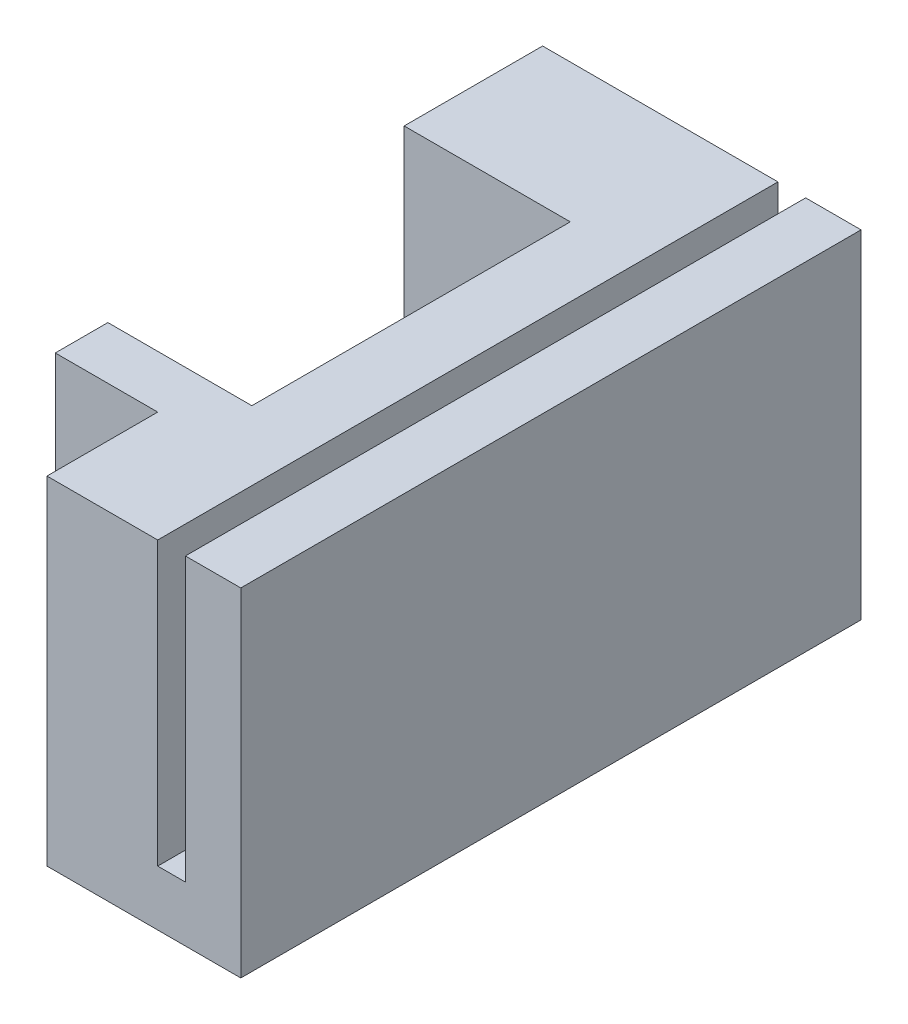
ISO-10303-21;
HEADER;
FILE_DESCRIPTION(('STEP AP214'),'2;1');
FILE_NAME('part.step','',(''),(''),'','','');
FILE_SCHEMA(('AUTOMOTIVE_DESIGN { 1 0 10303 214 1 1 1 1 }'));
ENDSEC;
DATA;
#1=APPLICATION_CONTEXT('core data for automotive mechanical design processes');
#2=APPLICATION_PROTOCOL_DEFINITION('international standard','automotive_design',2000,#1);
#3=PRODUCT_CONTEXT('',#1,'mechanical');
#4=PRODUCT('Part','Part','',(#3));
#5=PRODUCT_RELATED_PRODUCT_CATEGORY('part','',(#4));
#6=PRODUCT_DEFINITION_FORMATION('','',#4);
#7=PRODUCT_DEFINITION_CONTEXT('part definition',#1,'design');
#8=PRODUCT_DEFINITION('design','',#6,#7);
#9=PRODUCT_DEFINITION_SHAPE('','',#8);
#10=(LENGTH_UNIT() NAMED_UNIT(*) SI_UNIT(.MILLI.,.METRE.));
#11=(NAMED_UNIT(*) PLANE_ANGLE_UNIT() SI_UNIT($,.RADIAN.));
#12=(NAMED_UNIT(*) SI_UNIT($,.STERADIAN.) SOLID_ANGLE_UNIT());
#13=UNCERTAINTY_MEASURE_WITH_UNIT(LENGTH_MEASURE(1.E-05),#10,'distance_accuracy_value','');
#14=(GEOMETRIC_REPRESENTATION_CONTEXT(3) GLOBAL_UNCERTAINTY_ASSIGNED_CONTEXT((#13)) GLOBAL_UNIT_ASSIGNED_CONTEXT((#10,
#11,#12)) REPRESENTATION_CONTEXT('',''));
#15=CARTESIAN_POINT('',(0.,0.,0.));
#16=DIRECTION('',(0.,0.,1.));
#17=DIRECTION('',(1.,0.,0.));
#18=AXIS2_PLACEMENT_3D('',#15,#16,#17);
#19=CARTESIAN_POINT('',(8.5,12.2,0.));
#20=DIRECTION('',(1.,0.,0.));
#21=DIRECTION('',(0.,0.,-1.));
#22=AXIS2_PLACEMENT_3D('',#19,#20,#21);
#23=PLANE('',#22);
#24=DIRECTION('',(0.,0.,1.));
#25=VECTOR('',#24,1.);
#26=CARTESIAN_POINT('',(8.5,2.,0.));
#27=LINE('',#26,#25);
#28=CARTESIAN_POINT('',(8.5,2.,-5.));
#29=VERTEX_POINT('',#28);
#30=CARTESIAN_POINT('',(8.5,2.,17.4));
#31=VERTEX_POINT('',#30);
#32=EDGE_CURVE('E53',#29,#31,#27,.T.);
#33=ORIENTED_EDGE('',*,*,#32,.F.);
#34=DIRECTION('',(0.,-1.,0.));
#35=VECTOR('',#34,1.);
#36=CARTESIAN_POINT('',(8.5,12.2,-5.));
#37=LINE('',#36,#35);
#38=CARTESIAN_POINT('',(8.5,12.2,-5.));
#39=VERTEX_POINT('',#38);
#40=EDGE_CURVE('E11',#39,#29,#37,.T.);
#41=ORIENTED_EDGE('',*,*,#40,.F.);
#42=DIRECTION('',(0.,0.,1.));
#43=VECTOR('',#42,1.);
#44=CARTESIAN_POINT('',(8.5,12.2,0.));
#45=LINE('',#44,#43);
#46=CARTESIAN_POINT('',(8.5,12.2,17.4));
#47=VERTEX_POINT('',#46);
#48=EDGE_CURVE('E166',#39,#47,#45,.T.);
#49=ORIENTED_EDGE('',*,*,#48,.T.);
#50=DIRECTION('',(0.,-1.,0.));
#51=VECTOR('',#50,1.);
#52=CARTESIAN_POINT('',(8.5,12.2,17.4));
#53=LINE('',#52,#51);
#54=EDGE_CURVE('E144',#47,#31,#53,.T.);
#55=ORIENTED_EDGE('',*,*,#54,.T.);
#56=EDGE_LOOP('',(#33,#41,#49,#55));
#57=FACE_BOUND('',#56,.T.);
#58=ADVANCED_FACE('F39',(#57),#23,.T.);
#59=CARTESIAN_POINT('',(0.,12.2,-5.));
#60=DIRECTION('',(0.,0.,1.));
#61=DIRECTION('',(1.,0.,0.));
#62=AXIS2_PLACEMENT_3D('',#59,#60,#61);
#63=PLANE('',#62);
#64=DIRECTION('',(-1.,0.,0.));
#65=VECTOR('',#64,1.);
#66=CARTESIAN_POINT('',(0.,0.,-5.));
#67=LINE('',#66,#65);
#68=CARTESIAN_POINT('',(11.5,0.,-5.));
#69=VERTEX_POINT('',#68);
#70=CARTESIAN_POINT('',(0.,0.,-5.));
#71=VERTEX_POINT('',#70);
#72=EDGE_CURVE('E148',#69,#71,#67,.T.);
#73=ORIENTED_EDGE('',*,*,#72,.T.);
#74=DIRECTION('',(0.,-1.,0.));
#75=VECTOR('',#74,1.);
#76=CARTESIAN_POINT('',(0.,12.2,-5.));
#77=LINE('',#76,#75);
#78=CARTESIAN_POINT('',(0.,12.2,-5.));
#79=VERTEX_POINT('',#78);
#80=EDGE_CURVE('E46',#79,#71,#77,.T.);
#81=ORIENTED_EDGE('',*,*,#80,.F.);
#82=DIRECTION('',(-1.,0.,0.));
#83=VECTOR('',#82,1.);
#84=CARTESIAN_POINT('',(0.,12.2,-5.));
#85=LINE('',#84,#83);
#86=EDGE_CURVE('E216',#39,#79,#85,.T.);
#87=ORIENTED_EDGE('',*,*,#86,.F.);
#88=ORIENTED_EDGE('',*,*,#40,.T.);
#89=DIRECTION('',(-1.,0.,0.));
#90=VECTOR('',#89,1.);
#91=CARTESIAN_POINT('',(0.,2.,-5.));
#92=LINE('',#91,#90);
#93=CARTESIAN_POINT('',(9.50000000000001,2.,-5.));
#94=VERTEX_POINT('',#93);
#95=EDGE_CURVE('E225',#94,#29,#92,.T.);
#96=ORIENTED_EDGE('',*,*,#95,.F.);
#97=DIRECTION('',(0.,-1.,0.));
#98=VECTOR('',#97,1.);
#99=CARTESIAN_POINT('',(9.50000000000001,12.2,-5.));
#100=LINE('',#99,#98);
#101=CARTESIAN_POINT('',(9.50000000000001,12.2,-5.));
#102=VERTEX_POINT('',#101);
#103=EDGE_CURVE('E228',#102,#94,#100,.T.);
#104=ORIENTED_EDGE('',*,*,#103,.F.);
#105=DIRECTION('',(1.,0.,0.));
#106=VECTOR('',#105,1.);
#107=CARTESIAN_POINT('',(0.,12.2,-5.));
#108=LINE('',#107,#106);
#109=CARTESIAN_POINT('',(11.5,12.2,-5.));
#110=VERTEX_POINT('',#109);
#111=EDGE_CURVE('E243',#102,#110,#108,.T.);
#112=ORIENTED_EDGE('',*,*,#111,.T.);
#113=DIRECTION('',(0.,-1.,0.));
#114=VECTOR('',#113,1.);
#115=CARTESIAN_POINT('',(11.5,12.2,-5.));
#116=LINE('',#115,#114);
#117=EDGE_CURVE('E237',#110,#69,#116,.T.);
#118=ORIENTED_EDGE('',*,*,#117,.T.);
#119=EDGE_LOOP('',(#73,#81,#87,#88,#96,#104,#112,#118));
#120=FACE_BOUND('',#119,.T.);
#121=ADVANCED_FACE('F256',(#120),#63,.F.);
#122=CARTESIAN_POINT('',(0.,12.2,0.));
#123=DIRECTION('',(1.,0.,0.));
#124=DIRECTION('',(0.,0.,-1.));
#125=AXIS2_PLACEMENT_3D('',#122,#123,#124);
#126=PLANE('',#125);
#127=DIRECTION('',(0.,0.,1.));
#128=VECTOR('',#127,1.);
#129=CARTESIAN_POINT('',(0.,0.,0.));
#130=LINE('',#129,#128);
#131=CARTESIAN_POINT('',(0.,0.,0.));
#132=VERTEX_POINT('',#131);
#133=EDGE_CURVE('E150',#71,#132,#130,.T.);
#134=ORIENTED_EDGE('',*,*,#133,.T.);
#135=DIRECTION('',(0.,-1.,0.));
#136=VECTOR('',#135,1.);
#137=CARTESIAN_POINT('',(0.,12.2,0.));
#138=LINE('',#137,#136);
#139=CARTESIAN_POINT('',(0.,12.2,0.));
#140=VERTEX_POINT('',#139);
#141=EDGE_CURVE('E179',#140,#132,#138,.T.);
#142=ORIENTED_EDGE('',*,*,#141,.F.);
#143=DIRECTION('',(0.,0.,1.));
#144=VECTOR('',#143,1.);
#145=CARTESIAN_POINT('',(0.,12.2,0.));
#146=LINE('',#145,#144);
#147=EDGE_CURVE('E188',#79,#140,#146,.T.);
#148=ORIENTED_EDGE('',*,*,#147,.F.);
#149=ORIENTED_EDGE('',*,*,#80,.T.);
#150=EDGE_LOOP('',(#134,#142,#148,#149));
#151=FACE_BOUND('',#150,.T.);
#152=ADVANCED_FACE('F186',(#151),#126,.F.);
#153=CARTESIAN_POINT('',(0.,12.2,0.));
#154=DIRECTION('',(0.,0.,-1.));
#155=DIRECTION('',(-1.,0.,0.));
#156=AXIS2_PLACEMENT_3D('',#153,#154,#155);
#157=PLANE('',#156);
#158=DIRECTION('',(1.,0.,0.));
#159=VECTOR('',#158,1.);
#160=CARTESIAN_POINT('',(0.,0.,0.));
#161=LINE('',#160,#159);
#162=CARTESIAN_POINT('',(6.,0.,0.));
#163=VERTEX_POINT('',#162);
#164=EDGE_CURVE('E153',#132,#163,#161,.T.);
#165=ORIENTED_EDGE('',*,*,#164,.T.);
#166=DIRECTION('',(0.,-1.,0.));
#167=VECTOR('',#166,1.);
#168=CARTESIAN_POINT('',(6.,12.2,0.));
#169=LINE('',#168,#167);
#170=CARTESIAN_POINT('',(6.,12.2,0.));
#171=VERTEX_POINT('',#170);
#172=EDGE_CURVE('E176',#171,#163,#169,.T.);
#173=ORIENTED_EDGE('',*,*,#172,.F.);
#174=DIRECTION('',(1.,0.,0.));
#175=VECTOR('',#174,1.);
#176=CARTESIAN_POINT('',(0.,12.2,0.));
#177=LINE('',#176,#175);
#178=EDGE_CURVE('E210',#140,#171,#177,.T.);
#179=ORIENTED_EDGE('',*,*,#178,.F.);
#180=ORIENTED_EDGE('',*,*,#141,.T.);
#181=EDGE_LOOP('',(#165,#173,#179,#180));
#182=FACE_BOUND('',#181,.T.);
#183=ADVANCED_FACE('F201',(#182),#157,.F.);
#184=CARTESIAN_POINT('',(6.,12.2,0.));
#185=DIRECTION('',(1.,0.,0.));
#186=DIRECTION('',(0.,0.,-1.));
#187=AXIS2_PLACEMENT_3D('',#184,#185,#186);
#188=PLANE('',#187);
#189=DIRECTION('',(0.,0.,1.));
#190=VECTOR('',#189,1.);
#191=CARTESIAN_POINT('',(6.,0.,0.));
#192=LINE('',#191,#190);
#193=CARTESIAN_POINT('',(6.,0.,11.5));
#194=VERTEX_POINT('',#193);
#195=EDGE_CURVE('E155',#163,#194,#192,.T.);
#196=ORIENTED_EDGE('',*,*,#195,.T.);
#197=DIRECTION('',(0.,-1.,0.));
#198=VECTOR('',#197,1.);
#199=CARTESIAN_POINT('',(6.,12.2,11.5));
#200=LINE('',#199,#198);
#201=CARTESIAN_POINT('',(6.,12.2,11.5));
#202=VERTEX_POINT('',#201);
#203=EDGE_CURVE('E173',#202,#194,#200,.T.);
#204=ORIENTED_EDGE('',*,*,#203,.F.);
#205=DIRECTION('',(0.,0.,1.));
#206=VECTOR('',#205,1.);
#207=CARTESIAN_POINT('',(6.,12.2,0.));
#208=LINE('',#207,#206);
#209=EDGE_CURVE('E207',#171,#202,#208,.T.);
#210=ORIENTED_EDGE('',*,*,#209,.F.);
#211=ORIENTED_EDGE('',*,*,#172,.T.);
#212=EDGE_LOOP('',(#196,#204,#210,#211));
#213=FACE_BOUND('',#212,.T.);
#214=ADVANCED_FACE('F205',(#213),#188,.F.);
#215=CARTESIAN_POINT('',(0.,12.2,11.5));
#216=DIRECTION('',(0.,0.,1.));
#217=DIRECTION('',(1.,0.,0.));
#218=AXIS2_PLACEMENT_3D('',#215,#216,#217);
#219=PLANE('',#218);
#220=DIRECTION('',(-1.,0.,0.));
#221=VECTOR('',#220,1.);
#222=CARTESIAN_POINT('',(0.,0.,11.5));
#223=LINE('',#222,#221);
#224=CARTESIAN_POINT('',(0.800000000000002,0.,11.5));
#225=VERTEX_POINT('',#224);
#226=EDGE_CURVE('E157',#194,#225,#223,.T.);
#227=ORIENTED_EDGE('',*,*,#226,.T.);
#228=DIRECTION('',(0.,-1.,0.));
#229=VECTOR('',#228,1.);
#230=CARTESIAN_POINT('',(0.800000000000002,12.2,11.5));
#231=LINE('',#230,#229);
#232=CARTESIAN_POINT('',(0.800000000000002,12.2,11.5));
#233=VERTEX_POINT('',#232);
#234=EDGE_CURVE('E170',#233,#225,#231,.T.);
#235=ORIENTED_EDGE('',*,*,#234,.F.);
#236=DIRECTION('',(-1.,0.,0.));
#237=VECTOR('',#236,1.);
#238=CARTESIAN_POINT('',(0.,12.2,11.5));
#239=LINE('',#238,#237);
#240=EDGE_CURVE('E209',#202,#233,#239,.T.);
#241=ORIENTED_EDGE('',*,*,#240,.F.);
#242=ORIENTED_EDGE('',*,*,#203,.T.);
#243=EDGE_LOOP('',(#227,#235,#241,#242));
#244=FACE_BOUND('',#243,.T.);
#245=ADVANCED_FACE('F309',(#244),#219,.F.);
#246=CARTESIAN_POINT('',(0.799999999999998,12.2,0.));
#247=DIRECTION('',(1.,0.,0.));
#248=DIRECTION('',(0.,0.,-1.));
#249=AXIS2_PLACEMENT_3D('',#246,#247,#248);
#250=PLANE('',#249);
#251=DIRECTION('',(0.,0.,1.));
#252=VECTOR('',#251,1.);
#253=CARTESIAN_POINT('',(0.799999999999998,0.,0.));
#254=LINE('',#253,#252);
#255=CARTESIAN_POINT('',(0.800000000000002,0.,13.4));
#256=VERTEX_POINT('',#255);
#257=EDGE_CURVE('E159',#225,#256,#254,.T.);
#258=ORIENTED_EDGE('',*,*,#257,.T.);
#259=DIRECTION('',(0.,-1.,0.));
#260=VECTOR('',#259,1.);
#261=CARTESIAN_POINT('',(0.800000000000002,12.2,13.4));
#262=LINE('',#261,#260);
#263=CARTESIAN_POINT('',(0.800000000000002,12.2,13.4));
#264=VERTEX_POINT('',#263);
#265=EDGE_CURVE('E140',#264,#256,#262,.T.);
#266=ORIENTED_EDGE('',*,*,#265,.F.);
#267=DIRECTION('',(0.,0.,1.));
#268=VECTOR('',#267,1.);
#269=CARTESIAN_POINT('',(0.799999999999998,12.2,0.));
#270=LINE('',#269,#268);
#271=EDGE_CURVE('E127',#233,#264,#270,.T.);
#272=ORIENTED_EDGE('',*,*,#271,.F.);
#273=ORIENTED_EDGE('',*,*,#234,.T.);
#274=EDGE_LOOP('',(#258,#266,#272,#273));
#275=FACE_BOUND('',#274,.T.);
#276=ADVANCED_FACE('F312',(#275),#250,.F.);
#277=CARTESIAN_POINT('',(0.,12.2,13.4));
#278=DIRECTION('',(0.,0.,-1.));
#279=DIRECTION('',(-1.,0.,0.));
#280=AXIS2_PLACEMENT_3D('',#277,#278,#279);
#281=PLANE('',#280);
#282=DIRECTION('',(1.,0.,0.));
#283=VECTOR('',#282,1.);
#284=CARTESIAN_POINT('',(0.,0.,13.4));
#285=LINE('',#284,#283);
#286=CARTESIAN_POINT('',(4.5,0.,13.4));
#287=VERTEX_POINT('',#286);
#288=EDGE_CURVE('E136',#256,#287,#285,.T.);
#289=ORIENTED_EDGE('',*,*,#288,.T.);
#290=DIRECTION('',(0.,-1.,0.));
#291=VECTOR('',#290,1.);
#292=CARTESIAN_POINT('',(4.5,12.2,13.4));
#293=LINE('',#292,#291);
#294=CARTESIAN_POINT('',(4.5,12.2,13.4));
#295=VERTEX_POINT('',#294);
#296=EDGE_CURVE('E133',#295,#287,#293,.T.);
#297=ORIENTED_EDGE('',*,*,#296,.F.);
#298=DIRECTION('',(1.,0.,0.));
#299=VECTOR('',#298,1.);
#300=CARTESIAN_POINT('',(0.,12.2,13.4));
#301=LINE('',#300,#299);
#302=EDGE_CURVE('E121',#264,#295,#301,.T.);
#303=ORIENTED_EDGE('',*,*,#302,.F.);
#304=ORIENTED_EDGE('',*,*,#265,.T.);
#305=EDGE_LOOP('',(#289,#297,#303,#304));
#306=FACE_BOUND('',#305,.T.);
#307=ADVANCED_FACE('F134',(#306),#281,.F.);
#308=CARTESIAN_POINT('',(4.5,12.2,0.));
#309=DIRECTION('',(-1.,0.,0.));
#310=DIRECTION('',(0.,0.,1.));
#311=AXIS2_PLACEMENT_3D('',#308,#309,#310);
#312=PLANE('',#311);
#313=DIRECTION('',(0.,0.,-1.));
#314=VECTOR('',#313,1.);
#315=CARTESIAN_POINT('',(4.5,0.,0.));
#316=LINE('',#315,#314);
#317=CARTESIAN_POINT('',(4.5,0.,17.4));
#318=VERTEX_POINT('',#317);
#319=EDGE_CURVE('E162',#318,#287,#316,.T.);
#320=ORIENTED_EDGE('',*,*,#319,.F.);
#321=DIRECTION('',(0.,-1.,0.));
#322=VECTOR('',#321,1.);
#323=CARTESIAN_POINT('',(4.5,12.2,17.4));
#324=LINE('',#323,#322);
#325=CARTESIAN_POINT('',(4.5,12.2,17.4));
#326=VERTEX_POINT('',#325);
#327=EDGE_CURVE('E94',#326,#318,#324,.T.);
#328=ORIENTED_EDGE('',*,*,#327,.F.);
#329=DIRECTION('',(0.,0.,-1.));
#330=VECTOR('',#329,1.);
#331=CARTESIAN_POINT('',(4.5,12.2,0.));
#332=LINE('',#331,#330);
#333=EDGE_CURVE('E125',#326,#295,#332,.T.);
#334=ORIENTED_EDGE('',*,*,#333,.T.);
#335=ORIENTED_EDGE('',*,*,#296,.T.);
#336=EDGE_LOOP('',(#320,#328,#334,#335));
#337=FACE_BOUND('',#336,.T.);
#338=ADVANCED_FACE('F142',(#337),#312,.T.);
#339=CARTESIAN_POINT('',(0.,12.2,17.4));
#340=DIRECTION('',(0.,0.,-1.));
#341=DIRECTION('',(-1.,0.,0.));
#342=AXIS2_PLACEMENT_3D('',#339,#340,#341);
#343=PLANE('',#342);
#344=DIRECTION('',(1.,0.,0.));
#345=VECTOR('',#344,1.);
#346=CARTESIAN_POINT('',(0.,0.,17.4));
#347=LINE('',#346,#345);
#348=CARTESIAN_POINT('',(11.5,0.,17.4));
#349=VERTEX_POINT('',#348);
#350=EDGE_CURVE('E164',#318,#349,#347,.T.);
#351=ORIENTED_EDGE('',*,*,#350,.T.);
#352=DIRECTION('',(0.,-1.,0.));
#353=VECTOR('',#352,1.);
#354=CARTESIAN_POINT('',(11.5,12.2,17.4));
#355=LINE('',#354,#353);
#356=CARTESIAN_POINT('',(11.5,12.2,17.4));
#357=VERTEX_POINT('',#356);
#358=EDGE_CURVE('E234',#357,#349,#355,.T.);
#359=ORIENTED_EDGE('',*,*,#358,.F.);
#360=DIRECTION('',(1.,0.,0.));
#361=VECTOR('',#360,1.);
#362=CARTESIAN_POINT('',(0.,12.2,17.4));
#363=LINE('',#362,#361);
#364=CARTESIAN_POINT('',(9.50000000000001,12.2,17.4));
#365=VERTEX_POINT('',#364);
#366=EDGE_CURVE('E246',#365,#357,#363,.T.);
#367=ORIENTED_EDGE('',*,*,#366,.F.);
#368=DIRECTION('',(0.,-1.,0.));
#369=VECTOR('',#368,1.);
#370=CARTESIAN_POINT('',(9.50000000000001,12.2,17.4));
#371=LINE('',#370,#369);
#372=CARTESIAN_POINT('',(9.50000000000001,2.,17.4));
#373=VERTEX_POINT('',#372);
#374=EDGE_CURVE('E231',#365,#373,#371,.T.);
#375=ORIENTED_EDGE('',*,*,#374,.T.);
#376=DIRECTION('',(1.,0.,0.));
#377=VECTOR('',#376,1.);
#378=CARTESIAN_POINT('',(0.,2.,17.4));
#379=LINE('',#378,#377);
#380=EDGE_CURVE('E221',#31,#373,#379,.T.);
#381=ORIENTED_EDGE('',*,*,#380,.F.);
#382=ORIENTED_EDGE('',*,*,#54,.F.);
#383=DIRECTION('',(1.,0.,0.));
#384=VECTOR('',#383,1.);
#385=CARTESIAN_POINT('',(0.,12.2,17.4));
#386=LINE('',#385,#384);
#387=EDGE_CURVE('E61',#326,#47,#386,.T.);
#388=ORIENTED_EDGE('',*,*,#387,.F.);
#389=ORIENTED_EDGE('',*,*,#327,.T.);
#390=EDGE_LOOP('',(#351,#359,#367,#375,#381,#382,#388,#389));
#391=FACE_BOUND('',#390,.T.);
#392=ADVANCED_FACE('F277',(#391),#343,.F.);
#393=CARTESIAN_POINT('',(0.,12.2,0.));
#394=DIRECTION('',(0.,1.,0.));
#395=DIRECTION('',(0.,0.,1.));
#396=AXIS2_PLACEMENT_3D('',#393,#394,#395);
#397=PLANE('',#396);
#398=ORIENTED_EDGE('',*,*,#48,.F.);
#399=ORIENTED_EDGE('',*,*,#86,.T.);
#400=ORIENTED_EDGE('',*,*,#147,.T.);
#401=ORIENTED_EDGE('',*,*,#178,.T.);
#402=ORIENTED_EDGE('',*,*,#209,.T.);
#403=ORIENTED_EDGE('',*,*,#240,.T.);
#404=ORIENTED_EDGE('',*,*,#271,.T.);
#405=ORIENTED_EDGE('',*,*,#302,.T.);
#406=ORIENTED_EDGE('',*,*,#333,.F.);
#407=ORIENTED_EDGE('',*,*,#387,.T.);
#408=EDGE_LOOP('',(#398,#399,#400,#401,#402,#403,#404,#405,#406,#407));
#409=FACE_BOUND('',#408,.T.);
#410=ADVANCED_FACE('F123',(#409),#397,.T.);
#411=CARTESIAN_POINT('',(0.,0.,0.));
#412=DIRECTION('',(0.,1.,0.));
#413=DIRECTION('',(0.,0.,1.));
#414=AXIS2_PLACEMENT_3D('',#411,#412,#413);
#415=PLANE('',#414);
#416=ORIENTED_EDGE('',*,*,#72,.F.);
#417=DIRECTION('',(0.,0.,-1.));
#418=VECTOR('',#417,1.);
#419=CARTESIAN_POINT('',(11.5,0.,0.));
#420=LINE('',#419,#418);
#421=EDGE_CURVE('E240',#349,#69,#420,.T.);
#422=ORIENTED_EDGE('',*,*,#421,.F.);
#423=ORIENTED_EDGE('',*,*,#350,.F.);
#424=ORIENTED_EDGE('',*,*,#319,.T.);
#425=ORIENTED_EDGE('',*,*,#288,.F.);
#426=ORIENTED_EDGE('',*,*,#257,.F.);
#427=ORIENTED_EDGE('',*,*,#226,.F.);
#428=ORIENTED_EDGE('',*,*,#195,.F.);
#429=ORIENTED_EDGE('',*,*,#164,.F.);
#430=ORIENTED_EDGE('',*,*,#133,.F.);
#431=EDGE_LOOP('',(#416,#422,#423,#424,#425,#426,#427,#428,#429,#430));
#432=FACE_BOUND('',#431,.T.);
#433=ADVANCED_FACE('F193',(#432),#415,.F.);
#434=CARTESIAN_POINT('',(0.,2.,0.));
#435=DIRECTION('',(0.,1.,0.));
#436=DIRECTION('',(0.,0.,1.));
#437=AXIS2_PLACEMENT_3D('',#434,#435,#436);
#438=PLANE('',#437);
#439=ORIENTED_EDGE('',*,*,#95,.T.);
#440=ORIENTED_EDGE('',*,*,#32,.T.);
#441=ORIENTED_EDGE('',*,*,#380,.T.);
#442=DIRECTION('',(0.,0.,-1.));
#443=VECTOR('',#442,1.);
#444=CARTESIAN_POINT('',(9.50000000000001,2.,0.));
#445=LINE('',#444,#443);
#446=EDGE_CURVE('E151',#373,#94,#445,.T.);
#447=ORIENTED_EDGE('',*,*,#446,.T.);
#448=EDGE_LOOP('',(#439,#440,#441,#447));
#449=FACE_BOUND('',#448,.T.);
#450=ADVANCED_FACE('F285',(#449),#438,.T.);
#451=CARTESIAN_POINT('',(9.50000000000001,12.2,0.));
#452=DIRECTION('',(-1.,0.,0.));
#453=DIRECTION('',(0.,0.,1.));
#454=AXIS2_PLACEMENT_3D('',#451,#452,#453);
#455=PLANE('',#454);
#456=ORIENTED_EDGE('',*,*,#446,.F.);
#457=ORIENTED_EDGE('',*,*,#374,.F.);
#458=DIRECTION('',(0.,0.,-1.));
#459=VECTOR('',#458,1.);
#460=CARTESIAN_POINT('',(9.50000000000001,12.2,0.));
#461=LINE('',#460,#459);
#462=EDGE_CURVE('E249',#365,#102,#461,.T.);
#463=ORIENTED_EDGE('',*,*,#462,.T.);
#464=ORIENTED_EDGE('',*,*,#103,.T.);
#465=EDGE_LOOP('',(#456,#457,#463,#464));
#466=FACE_BOUND('',#465,.T.);
#467=ADVANCED_FACE('F272',(#466),#455,.T.);
#468=CARTESIAN_POINT('',(11.5,12.2,0.));
#469=DIRECTION('',(-1.,0.,0.));
#470=DIRECTION('',(0.,0.,1.));
#471=AXIS2_PLACEMENT_3D('',#468,#469,#470);
#472=PLANE('',#471);
#473=ORIENTED_EDGE('',*,*,#421,.T.);
#474=ORIENTED_EDGE('',*,*,#117,.F.);
#475=DIRECTION('',(0.,0.,-1.));
#476=VECTOR('',#475,1.);
#477=CARTESIAN_POINT('',(11.5,12.2,0.));
#478=LINE('',#477,#476);
#479=EDGE_CURVE('E239',#357,#110,#478,.T.);
#480=ORIENTED_EDGE('',*,*,#479,.F.);
#481=ORIENTED_EDGE('',*,*,#358,.T.);
#482=EDGE_LOOP('',(#473,#474,#480,#481));
#483=FACE_BOUND('',#482,.T.);
#484=ADVANCED_FACE('F292',(#483),#472,.F.);
#485=CARTESIAN_POINT('',(0.,12.2,0.));
#486=DIRECTION('',(0.,1.,0.));
#487=DIRECTION('',(0.,0.,1.));
#488=AXIS2_PLACEMENT_3D('',#485,#486,#487);
#489=PLANE('',#488);
#490=ORIENTED_EDGE('',*,*,#111,.F.);
#491=ORIENTED_EDGE('',*,*,#462,.F.);
#492=ORIENTED_EDGE('',*,*,#366,.T.);
#493=ORIENTED_EDGE('',*,*,#479,.T.);
#494=EDGE_LOOP('',(#490,#491,#492,#493));
#495=FACE_BOUND('',#494,.T.);
#496=ADVANCED_FACE('F265',(#495),#489,.T.);
#497=CLOSED_SHELL('',(#58,#121,#152,#183,#214,#245,#276,#307,#338,#392,#410,#433,#450,#467,#484,#496));
#498=MANIFOLD_SOLID_BREP('B2',#497);
#499=ADVANCED_BREP_SHAPE_REPRESENTATION('',(#18,#498),#14);
#500=SHAPE_DEFINITION_REPRESENTATION(#9,#499);
ENDSEC;
END-ISO-10303-21;
